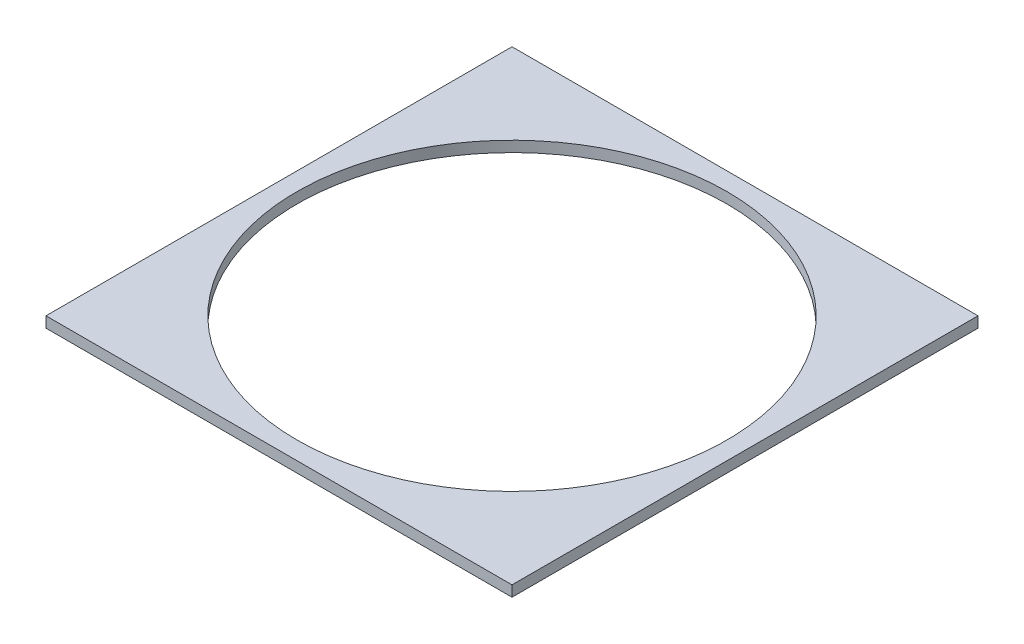
ISO-10303-21;
HEADER;
FILE_DESCRIPTION(('STEP AP214'),'2;1');
FILE_NAME('part.step','',(''),(''),'','','');
FILE_SCHEMA(('AUTOMOTIVE_DESIGN { 1 0 10303 214 1 1 1 1 }'));
ENDSEC;
DATA;
#1=APPLICATION_CONTEXT('core data for automotive mechanical design processes');
#2=APPLICATION_PROTOCOL_DEFINITION('international standard','automotive_design',2000,#1);
#3=PRODUCT_CONTEXT('',#1,'mechanical');
#4=PRODUCT('Part','Part','',(#3));
#5=PRODUCT_RELATED_PRODUCT_CATEGORY('part','',(#4));
#6=PRODUCT_DEFINITION_FORMATION('','',#4);
#7=PRODUCT_DEFINITION_CONTEXT('part definition',#1,'design');
#8=PRODUCT_DEFINITION('design','',#6,#7);
#9=PRODUCT_DEFINITION_SHAPE('','',#8);
#10=(LENGTH_UNIT() NAMED_UNIT(*) SI_UNIT(.MILLI.,.METRE.));
#11=(NAMED_UNIT(*) PLANE_ANGLE_UNIT() SI_UNIT($,.RADIAN.));
#12=(NAMED_UNIT(*) SI_UNIT($,.STERADIAN.) SOLID_ANGLE_UNIT());
#13=UNCERTAINTY_MEASURE_WITH_UNIT(LENGTH_MEASURE(1.E-05),#10,'distance_accuracy_value','');
#14=(GEOMETRIC_REPRESENTATION_CONTEXT(3) GLOBAL_UNCERTAINTY_ASSIGNED_CONTEXT((#13)) GLOBAL_UNIT_ASSIGNED_CONTEXT((#10,
#11,#12)) REPRESENTATION_CONTEXT('',''));
#15=CARTESIAN_POINT('',(0.,0.,0.));
#16=DIRECTION('',(0.,0.,1.));
#17=DIRECTION('',(1.,0.,0.));
#18=AXIS2_PLACEMENT_3D('',#15,#16,#17);
#19=CARTESIAN_POINT('',(0.,7.62,0.));
#20=DIRECTION('',(0.,1.,0.));
#21=DIRECTION('',(0.,0.,1.));
#22=AXIS2_PLACEMENT_3D('',#19,#20,#21);
#23=PLANE('',#22);
#24=DIRECTION('',(0.,0.,-1.));
#25=VECTOR('',#24,1.);
#26=CARTESIAN_POINT('',(165.1,7.62,-165.1));
#27=LINE('',#26,#25);
#28=CARTESIAN_POINT('',(165.1,7.62,165.1));
#29=VERTEX_POINT('',#28);
#30=CARTESIAN_POINT('',(165.1,7.62,-165.1));
#31=VERTEX_POINT('',#30);
#32=EDGE_CURVE('E84',#29,#31,#27,.T.);
#33=ORIENTED_EDGE('',*,*,#32,.T.);
#34=DIRECTION('',(-1.,0.,0.));
#35=VECTOR('',#34,1.);
#36=CARTESIAN_POINT('',(-165.1,7.62,-165.1));
#37=LINE('',#36,#35);
#38=CARTESIAN_POINT('',(-165.1,7.62,-165.1));
#39=VERTEX_POINT('',#38);
#40=EDGE_CURVE('E79',#31,#39,#37,.T.);
#41=ORIENTED_EDGE('',*,*,#40,.T.);
#42=DIRECTION('',(0.,0.,1.));
#43=VECTOR('',#42,1.);
#44=CARTESIAN_POINT('',(-165.1,7.62,-165.1));
#45=LINE('',#44,#43);
#46=CARTESIAN_POINT('',(-165.1,7.62,165.1));
#47=VERTEX_POINT('',#46);
#48=EDGE_CURVE('E82',#39,#47,#45,.T.);
#49=ORIENTED_EDGE('',*,*,#48,.T.);
#50=DIRECTION('',(1.,0.,0.));
#51=VECTOR('',#50,1.);
#52=CARTESIAN_POINT('',(-165.1,7.62,165.1));
#53=LINE('',#52,#51);
#54=EDGE_CURVE('E49',#47,#29,#53,.T.);
#55=ORIENTED_EDGE('',*,*,#54,.T.);
#56=EDGE_LOOP('',(#33,#41,#49,#55));
#57=FACE_BOUND('',#56,.T.);
#58=CARTESIAN_POINT('',(0.,7.62,0.));
#59=DIRECTION('',(0.,1.,0.));
#60=DIRECTION('',(0.,0.,1.));
#61=AXIS2_PLACEMENT_3D('',#58,#59,#60);
#62=CIRCLE('',#61,152.4);
#63=CARTESIAN_POINT('',(0.,7.62,-152.4));
#64=VERTEX_POINT('',#63);
#65=EDGE_CURVE('E99',#64,#64,#62,.T.);
#66=ORIENTED_EDGE('',*,*,#65,.F.);
#67=EDGE_LOOP('',(#66));
#68=FACE_BOUND('',#67,.T.);
#69=ADVANCED_FACE('F32',(#57,#68),#23,.T.);
#70=CARTESIAN_POINT('',(0.,0.,0.));
#71=DIRECTION('',(0.,1.,0.));
#72=DIRECTION('',(0.,0.,1.));
#73=AXIS2_PLACEMENT_3D('',#70,#71,#72);
#74=PLANE('',#73);
#75=DIRECTION('',(0.,0.,-1.));
#76=VECTOR('',#75,1.);
#77=CARTESIAN_POINT('',(165.1,0.,-165.1));
#78=LINE('',#77,#76);
#79=CARTESIAN_POINT('',(165.1,0.,165.1));
#80=VERTEX_POINT('',#79);
#81=CARTESIAN_POINT('',(165.1,0.,-165.1));
#82=VERTEX_POINT('',#81);
#83=EDGE_CURVE('E96',#80,#82,#78,.T.);
#84=ORIENTED_EDGE('',*,*,#83,.F.);
#85=DIRECTION('',(1.,0.,0.));
#86=VECTOR('',#85,1.);
#87=CARTESIAN_POINT('',(-165.1,0.,165.1));
#88=LINE('',#87,#86);
#89=CARTESIAN_POINT('',(-165.1,0.,165.1));
#90=VERTEX_POINT('',#89);
#91=EDGE_CURVE('E72',#90,#80,#88,.T.);
#92=ORIENTED_EDGE('',*,*,#91,.F.);
#93=DIRECTION('',(0.,0.,1.));
#94=VECTOR('',#93,1.);
#95=CARTESIAN_POINT('',(-165.1,0.,-165.1));
#96=LINE('',#95,#94);
#97=CARTESIAN_POINT('',(-165.1,0.,-165.1));
#98=VERTEX_POINT('',#97);
#99=EDGE_CURVE('E66',#98,#90,#96,.T.);
#100=ORIENTED_EDGE('',*,*,#99,.F.);
#101=DIRECTION('',(-1.,0.,0.));
#102=VECTOR('',#101,1.);
#103=CARTESIAN_POINT('',(-165.1,0.,-165.1));
#104=LINE('',#103,#102);
#105=EDGE_CURVE('E88',#82,#98,#104,.T.);
#106=ORIENTED_EDGE('',*,*,#105,.F.);
#107=EDGE_LOOP('',(#84,#92,#100,#106));
#108=FACE_BOUND('',#107,.T.);
#109=CARTESIAN_POINT('',(0.,0.,0.));
#110=DIRECTION('',(0.,1.,0.));
#111=DIRECTION('',(0.,0.,1.));
#112=AXIS2_PLACEMENT_3D('',#109,#110,#111);
#113=CIRCLE('',#112,152.4);
#114=CARTESIAN_POINT('',(0.,0.,-152.4));
#115=VERTEX_POINT('',#114);
#116=EDGE_CURVE('E111',#115,#115,#113,.T.);
#117=ORIENTED_EDGE('',*,*,#116,.T.);
#118=EDGE_LOOP('',(#117));
#119=FACE_BOUND('',#118,.T.);
#120=ADVANCED_FACE('F107',(#108,#119),#74,.F.);
#121=CARTESIAN_POINT('',(165.1,7.62,-165.1));
#122=DIRECTION('',(-1.,0.,0.));
#123=DIRECTION('',(0.,0.,1.));
#124=AXIS2_PLACEMENT_3D('',#121,#122,#123);
#125=PLANE('',#124);
#126=ORIENTED_EDGE('',*,*,#83,.T.);
#127=DIRECTION('',(0.,-1.,0.));
#128=VECTOR('',#127,1.);
#129=CARTESIAN_POINT('',(165.1,7.62,-165.1));
#130=LINE('',#129,#128);
#131=EDGE_CURVE('E11',#31,#82,#130,.T.);
#132=ORIENTED_EDGE('',*,*,#131,.F.);
#133=ORIENTED_EDGE('',*,*,#32,.F.);
#134=DIRECTION('',(0.,-1.,0.));
#135=VECTOR('',#134,1.);
#136=CARTESIAN_POINT('',(165.1,7.62,165.1));
#137=LINE('',#136,#135);
#138=EDGE_CURVE('E92',#29,#80,#137,.T.);
#139=ORIENTED_EDGE('',*,*,#138,.T.);
#140=EDGE_LOOP('',(#126,#132,#133,#139));
#141=FACE_BOUND('',#140,.T.);
#142=ADVANCED_FACE('F34',(#141),#125,.F.);
#143=CARTESIAN_POINT('',(-165.1,7.62,-165.1));
#144=DIRECTION('',(0.,0.,1.));
#145=DIRECTION('',(1.,0.,0.));
#146=AXIS2_PLACEMENT_3D('',#143,#144,#145);
#147=PLANE('',#146);
#148=ORIENTED_EDGE('',*,*,#105,.T.);
#149=DIRECTION('',(0.,-1.,0.));
#150=VECTOR('',#149,1.);
#151=CARTESIAN_POINT('',(-165.1,7.62,-165.1));
#152=LINE('',#151,#150);
#153=EDGE_CURVE('E41',#39,#98,#152,.T.);
#154=ORIENTED_EDGE('',*,*,#153,.F.);
#155=ORIENTED_EDGE('',*,*,#40,.F.);
#156=ORIENTED_EDGE('',*,*,#131,.T.);
#157=EDGE_LOOP('',(#148,#154,#155,#156));
#158=FACE_BOUND('',#157,.T.);
#159=ADVANCED_FACE('F87',(#158),#147,.F.);
#160=CARTESIAN_POINT('',(-165.1,7.62,-165.1));
#161=DIRECTION('',(1.,0.,0.));
#162=DIRECTION('',(0.,0.,-1.));
#163=AXIS2_PLACEMENT_3D('',#160,#161,#162);
#164=PLANE('',#163);
#165=ORIENTED_EDGE('',*,*,#99,.T.);
#166=DIRECTION('',(0.,-1.,0.));
#167=VECTOR('',#166,1.);
#168=CARTESIAN_POINT('',(-165.1,7.62,165.1));
#169=LINE('',#168,#167);
#170=EDGE_CURVE('E89',#47,#90,#169,.T.);
#171=ORIENTED_EDGE('',*,*,#170,.F.);
#172=ORIENTED_EDGE('',*,*,#48,.F.);
#173=ORIENTED_EDGE('',*,*,#153,.T.);
#174=EDGE_LOOP('',(#165,#171,#172,#173));
#175=FACE_BOUND('',#174,.T.);
#176=ADVANCED_FACE('F90',(#175),#164,.F.);
#177=CARTESIAN_POINT('',(-165.1,7.62,165.1));
#178=DIRECTION('',(0.,0.,-1.));
#179=DIRECTION('',(-1.,0.,0.));
#180=AXIS2_PLACEMENT_3D('',#177,#178,#179);
#181=PLANE('',#180);
#182=ORIENTED_EDGE('',*,*,#91,.T.);
#183=ORIENTED_EDGE('',*,*,#138,.F.);
#184=ORIENTED_EDGE('',*,*,#54,.F.);
#185=ORIENTED_EDGE('',*,*,#170,.T.);
#186=EDGE_LOOP('',(#182,#183,#184,#185));
#187=FACE_BOUND('',#186,.T.);
#188=ADVANCED_FACE('F104',(#187),#181,.F.);
#189=CARTESIAN_POINT('',(0.,7.62,0.));
#190=DIRECTION('',(0.,-1.,0.));
#191=DIRECTION('',(0.,0.,-1.));
#192=AXIS2_PLACEMENT_3D('',#189,#190,#191);
#193=CYLINDRICAL_SURFACE('',#192,152.4);
#194=CARTESIAN_POINT('',(0.,7.62,-152.4));
#195=CARTESIAN_POINT('',(0.,7.540625,-152.4));
#196=CARTESIAN_POINT('',(0.,7.46125,-152.4));
#197=CARTESIAN_POINT('',(0.,7.3025,-152.4));
#198=CARTESIAN_POINT('',(0.,7.223125,-152.4));
#199=CARTESIAN_POINT('',(0.,7.064375,-152.4));
#200=CARTESIAN_POINT('',(0.,6.985,-152.4));
#201=CARTESIAN_POINT('',(0.,6.82625,-152.4));
#202=CARTESIAN_POINT('',(0.,6.746875,-152.4));
#203=CARTESIAN_POINT('',(0.,6.588125,-152.4));
#204=CARTESIAN_POINT('',(0.,6.50875,-152.4));
#205=CARTESIAN_POINT('',(0.,6.35,-152.4));
#206=CARTESIAN_POINT('',(0.,6.270625,-152.4));
#207=CARTESIAN_POINT('',(0.,6.111875,-152.4));
#208=CARTESIAN_POINT('',(0.,6.0325,-152.4));
#209=CARTESIAN_POINT('',(0.,5.87375,-152.4));
#210=CARTESIAN_POINT('',(0.,5.794375,-152.4));
#211=CARTESIAN_POINT('',(0.,5.635625,-152.4));
#212=CARTESIAN_POINT('',(0.,5.55625,-152.4));
#213=CARTESIAN_POINT('',(0.,5.3975,-152.4));
#214=CARTESIAN_POINT('',(0.,5.318125,-152.4));
#215=CARTESIAN_POINT('',(0.,5.159375,-152.4));
#216=CARTESIAN_POINT('',(0.,5.08,-152.4));
#217=CARTESIAN_POINT('',(0.,4.92125,-152.4));
#218=CARTESIAN_POINT('',(0.,4.841875,-152.4));
#219=CARTESIAN_POINT('',(0.,4.683125,-152.4));
#220=CARTESIAN_POINT('',(0.,4.60375,-152.4));
#221=CARTESIAN_POINT('',(0.,4.445,-152.4));
#222=CARTESIAN_POINT('',(0.,4.365625,-152.4));
#223=CARTESIAN_POINT('',(0.,4.206875,-152.4));
#224=CARTESIAN_POINT('',(0.,4.1275,-152.4));
#225=CARTESIAN_POINT('',(0.,3.96875,-152.4));
#226=CARTESIAN_POINT('',(0.,3.889375,-152.4));
#227=CARTESIAN_POINT('',(0.,3.730625,-152.4));
#228=CARTESIAN_POINT('',(0.,3.65125,-152.4));
#229=CARTESIAN_POINT('',(0.,3.4925,-152.4));
#230=CARTESIAN_POINT('',(0.,3.413125,-152.4));
#231=CARTESIAN_POINT('',(0.,3.254375,-152.4));
#232=CARTESIAN_POINT('',(0.,3.175,-152.4));
#233=CARTESIAN_POINT('',(0.,3.01625,-152.4));
#234=CARTESIAN_POINT('',(0.,2.936875,-152.4));
#235=CARTESIAN_POINT('',(0.,2.778125,-152.4));
#236=CARTESIAN_POINT('',(0.,2.69875,-152.4));
#237=CARTESIAN_POINT('',(0.,2.54,-152.4));
#238=CARTESIAN_POINT('',(0.,2.460625,-152.4));
#239=CARTESIAN_POINT('',(0.,2.301875,-152.4));
#240=CARTESIAN_POINT('',(0.,2.2225,-152.4));
#241=CARTESIAN_POINT('',(0.,2.06375,-152.4));
#242=CARTESIAN_POINT('',(0.,1.984375,-152.4));
#243=CARTESIAN_POINT('',(0.,1.825625,-152.4));
#244=CARTESIAN_POINT('',(0.,1.74625,-152.4));
#245=CARTESIAN_POINT('',(0.,1.5875,-152.4));
#246=CARTESIAN_POINT('',(0.,1.508125,-152.4));
#247=CARTESIAN_POINT('',(0.,1.349375,-152.4));
#248=CARTESIAN_POINT('',(0.,1.27,-152.4));
#249=CARTESIAN_POINT('',(0.,1.11125,-152.4));
#250=CARTESIAN_POINT('',(0.,1.031875,-152.4));
#251=CARTESIAN_POINT('',(0.,0.873125,-152.4));
#252=CARTESIAN_POINT('',(0.,0.79375,-152.4));
#253=CARTESIAN_POINT('',(0.,0.635,-152.4));
#254=CARTESIAN_POINT('',(0.,0.555625,-152.4));
#255=CARTESIAN_POINT('',(0.,0.396875,-152.4));
#256=CARTESIAN_POINT('',(0.,0.3175,-152.4));
#257=CARTESIAN_POINT('',(0.,0.15875,-152.4));
#258=CARTESIAN_POINT('',(0.,0.0793749999999999,-152.4));
#259=CARTESIAN_POINT('',(0.,0.,-152.4));
#260=B_SPLINE_CURVE_WITH_KNOTS('',3,(#194,#195,#196,#197,#198,#199,#200,#201,#202,#203,#204,
#205,#206,#207,#208,#209,#210,#211,#212,#213,#214,#215,#216,#217,#218,#219,#220,#221,#222,#223,
#224,#225,#226,#227,#228,#229,#230,#231,#232,#233,#234,#235,#236,#237,#238,#239,#240,#241,#242,
#243,#244,#245,#246,#247,#248,#249,#250,#251,#252,#253,#254,#255,#256,#257,#258,#259),
.UNSPECIFIED.,.F.,.F.,(4,2,2,2,2,2,2,2,2,2,2,2,2,2,2,2,2,2,2,2,2,2,2,2,2,2,2,2,2,2,2,2,4),(0.,
0.238125,0.476249999999999,0.714375,0.952499999999999,1.190625,1.42875,1.666875,1.905,2.143125,
2.38125,2.619375,2.8575,3.095625,3.33375,3.571875,3.81,4.048125,4.28625,4.524375,4.7625,
5.000625,5.23875,5.476875,5.715,5.953125,6.19125,6.429375,6.6675,6.905625,7.14375,7.381875,
7.62),.UNSPECIFIED.);
#261=EDGE_CURVE('BSEAM117',#64,#115,#260,.T.);
#262=ORIENTED_EDGE('',*,*,#65,.T.);
#263=ORIENTED_EDGE('',*,*,#116,.F.);
#264=ORIENTED_EDGE('',*,*,#261,.T.);
#265=ORIENTED_EDGE('',*,*,#261,.F.);
#266=EDGE_LOOP('',(#262,#264,#263,#265));
#267=FACE_BOUND('',#266,.T.);
#268=ADVANCED_FACE('F117',(#267),#193,.F.);
#269=CLOSED_SHELL('',(#69,#120,#142,#159,#176,#188,#268));
#270=MANIFOLD_SOLID_BREP('B2',#269);
#271=ADVANCED_BREP_SHAPE_REPRESENTATION('',(#18,#270),#14);
#272=SHAPE_DEFINITION_REPRESENTATION(#9,#271);
ENDSEC;
END-ISO-10303-21;
